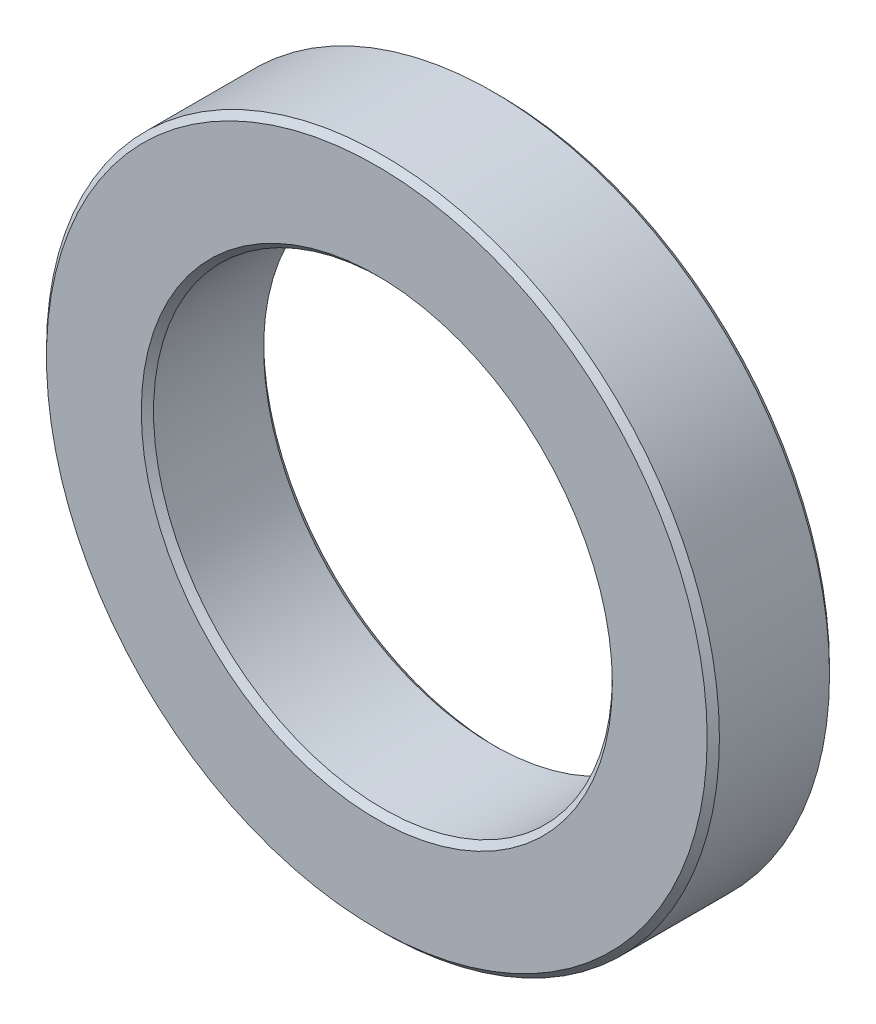
ISO-10303-21;
HEADER;
FILE_DESCRIPTION(('STEP AP214'),'2;1');
FILE_NAME('part.step','',(''),(''),'','','');
FILE_SCHEMA(('AUTOMOTIVE_DESIGN { 1 0 10303 214 1 1 1 1 }'));
ENDSEC;
DATA;
#1=APPLICATION_CONTEXT('core data for automotive mechanical design processes');
#2=APPLICATION_PROTOCOL_DEFINITION('international standard','automotive_design',2000,#1);
#3=PRODUCT_CONTEXT('',#1,'mechanical');
#4=PRODUCT('Part','Part','',(#3));
#5=PRODUCT_RELATED_PRODUCT_CATEGORY('part','',(#4));
#6=PRODUCT_DEFINITION_FORMATION('','',#4);
#7=PRODUCT_DEFINITION_CONTEXT('part definition',#1,'design');
#8=PRODUCT_DEFINITION('design','',#6,#7);
#9=PRODUCT_DEFINITION_SHAPE('','',#8);
#10=(LENGTH_UNIT() NAMED_UNIT(*) SI_UNIT(.MILLI.,.METRE.));
#11=(NAMED_UNIT(*) PLANE_ANGLE_UNIT() SI_UNIT($,.RADIAN.));
#12=(NAMED_UNIT(*) SI_UNIT($,.STERADIAN.) SOLID_ANGLE_UNIT());
#13=UNCERTAINTY_MEASURE_WITH_UNIT(LENGTH_MEASURE(1.E-05),#10,'distance_accuracy_value','');
#14=(GEOMETRIC_REPRESENTATION_CONTEXT(3) GLOBAL_UNCERTAINTY_ASSIGNED_CONTEXT((#13)) GLOBAL_UNIT_ASSIGNED_CONTEXT((#10,
#11,#12)) REPRESENTATION_CONTEXT('',''));
#15=CARTESIAN_POINT('',(0.,0.,0.));
#16=DIRECTION('',(0.,0.,1.));
#17=DIRECTION('',(1.,0.,0.));
#18=AXIS2_PLACEMENT_3D('',#15,#16,#17);
#19=CARTESIAN_POINT('',(-7.28115294937452,5.29006727063225,12.));
#20=DIRECTION('',(0.,0.,-1.));
#21=DIRECTION('',(-1.,0.,0.));
#22=AXIS2_PLACEMENT_3D('',#19,#20,#21);
#23=CYLINDRICAL_SURFACE('',#22,0.999999999999984);
#24=CARTESIAN_POINT('',(-7.28115294937452,5.29006727063225,0.));
#25=DIRECTION('',(0.,0.,1.));
#26=DIRECTION('',(1.,0.,0.));
#27=AXIS2_PLACEMENT_3D('',#24,#25,#26);
#28=CIRCLE('',#27,0.999999999999984);
#29=CARTESIAN_POINT('',(-6.28115294937453,5.29006727063225,0.));
#30=VERTEX_POINT('',#29);
#31=EDGE_CURVE('E98',#30,#30,#28,.T.);
#32=ORIENTED_EDGE('',*,*,#31,.F.);
#33=EDGE_LOOP('',(#32));
#34=FACE_BOUND('',#33,.T.);
#35=CARTESIAN_POINT('',(-7.28115294937452,5.29006727063225,3.));
#36=DIRECTION('',(0.,0.,1.));
#37=DIRECTION('',(1.,0.,0.));
#38=AXIS2_PLACEMENT_3D('',#35,#36,#37);
#39=CIRCLE('',#38,0.999999999999984);
#40=CARTESIAN_POINT('',(-6.28115294937453,5.29006727063225,3.));
#41=VERTEX_POINT('',#40);
#42=EDGE_CURVE('E74',#41,#41,#39,.F.);
#43=ORIENTED_EDGE('',*,*,#42,.F.);
#44=EDGE_LOOP('',(#43));
#45=FACE_BOUND('',#44,.T.);
#46=ADVANCED_FACE('F41',(#34,#45),#23,.F.);
#47=CARTESIAN_POINT('',(2.78115294937452,8.55950864665637,12.));
#48=DIRECTION('',(0.,0.,-1.));
#49=DIRECTION('',(-1.,0.,0.));
#50=AXIS2_PLACEMENT_3D('',#47,#48,#49);
#51=CYLINDRICAL_SURFACE('',#50,0.999999999999898);
#52=CARTESIAN_POINT('',(2.78115294937452,8.55950864665637,0.));
#53=DIRECTION('',(0.,0.,1.));
#54=DIRECTION('',(1.,0.,0.));
#55=AXIS2_PLACEMENT_3D('',#52,#53,#54);
#56=CIRCLE('',#55,0.999999999999898);
#57=CARTESIAN_POINT('',(3.78115294937442,8.55950864665637,0.));
#58=VERTEX_POINT('',#57);
#59=EDGE_CURVE('E101',#58,#58,#56,.T.);
#60=ORIENTED_EDGE('',*,*,#59,.F.);
#61=EDGE_LOOP('',(#60));
#62=FACE_BOUND('',#61,.T.);
#63=CARTESIAN_POINT('',(2.78115294937452,8.55950864665637,3.));
#64=DIRECTION('',(0.,0.,1.));
#65=DIRECTION('',(1.,0.,0.));
#66=AXIS2_PLACEMENT_3D('',#63,#64,#65);
#67=CIRCLE('',#66,0.999999999999898);
#68=CARTESIAN_POINT('',(3.78115294937442,8.55950864665637,3.));
#69=VERTEX_POINT('',#68);
#70=EDGE_CURVE('E77',#69,#69,#67,.F.);
#71=ORIENTED_EDGE('',*,*,#70,.F.);
#72=EDGE_LOOP('',(#71));
#73=FACE_BOUND('',#72,.T.);
#74=ADVANCED_FACE('F107',(#62,#73),#51,.F.);
#75=CARTESIAN_POINT('',(9.00000000000001,0.,12.));
#76=DIRECTION('',(0.,0.,-1.));
#77=DIRECTION('',(-1.,0.,0.));
#78=AXIS2_PLACEMENT_3D('',#75,#76,#77);
#79=CYLINDRICAL_SURFACE('',#78,1.00000000000001);
#80=CARTESIAN_POINT('',(9.00000000000001,0.,0.));
#81=DIRECTION('',(0.,0.,1.));
#82=DIRECTION('',(1.,0.,0.));
#83=AXIS2_PLACEMENT_3D('',#80,#81,#82);
#84=CIRCLE('',#83,1.00000000000001);
#85=CARTESIAN_POINT('',(10.,0.,0.));
#86=VERTEX_POINT('',#85);
#87=EDGE_CURVE('E89',#86,#86,#84,.T.);
#88=ORIENTED_EDGE('',*,*,#87,.F.);
#89=EDGE_LOOP('',(#88));
#90=FACE_BOUND('',#89,.T.);
#91=CARTESIAN_POINT('',(9.00000000000001,0.,3.));
#92=DIRECTION('',(0.,0.,1.));
#93=DIRECTION('',(1.,0.,0.));
#94=AXIS2_PLACEMENT_3D('',#91,#92,#93);
#95=CIRCLE('',#94,1.00000000000001);
#96=CARTESIAN_POINT('',(10.,0.,3.));
#97=VERTEX_POINT('',#96);
#98=EDGE_CURVE('E80',#97,#97,#95,.F.);
#99=ORIENTED_EDGE('',*,*,#98,.F.);
#100=EDGE_LOOP('',(#99));
#101=FACE_BOUND('',#100,.T.);
#102=ADVANCED_FACE('F110',(#90,#101),#79,.F.);
#103=CARTESIAN_POINT('',(2.78115294937453,-8.55950864665637,12.));
#104=DIRECTION('',(0.,0.,-1.));
#105=DIRECTION('',(-1.,0.,0.));
#106=AXIS2_PLACEMENT_3D('',#103,#104,#105);
#107=CYLINDRICAL_SURFACE('',#106,1.00000000000002);
#108=CARTESIAN_POINT('',(2.78115294937453,-8.55950864665637,0.));
#109=DIRECTION('',(0.,0.,1.));
#110=DIRECTION('',(1.,0.,0.));
#111=AXIS2_PLACEMENT_3D('',#108,#109,#110);
#112=CIRCLE('',#111,1.00000000000002);
#113=CARTESIAN_POINT('',(3.78115294937454,-8.55950864665637,0.));
#114=VERTEX_POINT('',#113);
#115=EDGE_CURVE('E92',#114,#114,#112,.T.);
#116=ORIENTED_EDGE('',*,*,#115,.F.);
#117=EDGE_LOOP('',(#116));
#118=FACE_BOUND('',#117,.T.);
#119=CARTESIAN_POINT('',(2.78115294937453,-8.55950864665637,3.));
#120=DIRECTION('',(0.,0.,1.));
#121=DIRECTION('',(1.,0.,0.));
#122=AXIS2_PLACEMENT_3D('',#119,#120,#121);
#123=CIRCLE('',#122,1.00000000000002);
#124=CARTESIAN_POINT('',(3.78115294937454,-8.55950864665637,3.));
#125=VERTEX_POINT('',#124);
#126=EDGE_CURVE('E83',#125,#125,#123,.F.);
#127=ORIENTED_EDGE('',*,*,#126,.F.);
#128=EDGE_LOOP('',(#127));
#129=FACE_BOUND('',#128,.T.);
#130=ADVANCED_FACE('F137',(#118,#129),#107,.F.);
#131=CARTESIAN_POINT('',(-7.28115294937452,-5.29006727063225,12.));
#132=DIRECTION('',(0.,0.,-1.));
#133=DIRECTION('',(-1.,0.,0.));
#134=AXIS2_PLACEMENT_3D('',#131,#132,#133);
#135=CYLINDRICAL_SURFACE('',#134,1.00000000000005);
#136=CARTESIAN_POINT('',(-7.28115294937452,-5.29006727063225,0.));
#137=DIRECTION('',(0.,0.,1.));
#138=DIRECTION('',(1.,0.,0.));
#139=AXIS2_PLACEMENT_3D('',#136,#137,#138);
#140=CIRCLE('',#139,1.00000000000005);
#141=CARTESIAN_POINT('',(-6.28115294937447,-5.29006727063225,0.));
#142=VERTEX_POINT('',#141);
#143=EDGE_CURVE('E95',#142,#142,#140,.T.);
#144=ORIENTED_EDGE('',*,*,#143,.F.);
#145=EDGE_LOOP('',(#144));
#146=FACE_BOUND('',#145,.T.);
#147=CARTESIAN_POINT('',(-7.28115294937452,-5.29006727063225,3.));
#148=DIRECTION('',(0.,0.,1.));
#149=DIRECTION('',(1.,0.,0.));
#150=AXIS2_PLACEMENT_3D('',#147,#148,#149);
#151=CIRCLE('',#150,1.00000000000005);
#152=CARTESIAN_POINT('',(-6.28115294937447,-5.29006727063225,3.));
#153=VERTEX_POINT('',#152);
#154=EDGE_CURVE('E86',#153,#153,#151,.F.);
#155=ORIENTED_EDGE('',*,*,#154,.F.);
#156=EDGE_LOOP('',(#155));
#157=FACE_BOUND('',#156,.T.);
#158=ADVANCED_FACE('F143',(#146,#157),#135,.F.);
#159=CARTESIAN_POINT('',(0.,0.,4.));
#160=DIRECTION('',(0.,0.,1.));
#161=DIRECTION('',(1.,0.,0.));
#162=AXIS2_PLACEMENT_3D('',#159,#160,#161);
#163=PLANE('',#162);
#164=CARTESIAN_POINT('',(0.,0.,4.));
#165=DIRECTION('',(0.,0.,1.));
#166=DIRECTION('',(1.,0.,0.));
#167=AXIS2_PLACEMENT_3D('',#164,#165,#166);
#168=CIRCLE('',#167,10.8);
#169=CARTESIAN_POINT('',(10.8,0.,4.));
#170=VERTEX_POINT('',#169);
#171=EDGE_CURVE('E53',#170,#170,#168,.T.);
#172=ORIENTED_EDGE('',*,*,#171,.T.);
#173=EDGE_LOOP('',(#172));
#174=FACE_BOUND('',#173,.T.);
#175=CARTESIAN_POINT('',(0.,0.,4.));
#176=DIRECTION('',(0.,0.,1.));
#177=DIRECTION('',(1.,0.,0.));
#178=AXIS2_PLACEMENT_3D('',#175,#176,#177);
#179=CIRCLE('',#178,7.69999999999999);
#180=CARTESIAN_POINT('',(7.69999999999999,0.,4.));
#181=VERTEX_POINT('',#180);
#182=EDGE_CURVE('E57',#181,#181,#179,.F.);
#183=ORIENTED_EDGE('',*,*,#182,.T.);
#184=EDGE_LOOP('',(#183));
#185=FACE_BOUND('',#184,.T.);
#186=ADVANCED_FACE('F146',(#174,#185),#163,.T.);
#187=CARTESIAN_POINT('',(0.,0.,0.));
#188=DIRECTION('',(0.,0.,1.));
#189=DIRECTION('',(1.,0.,0.));
#190=AXIS2_PLACEMENT_3D('',#187,#188,#189);
#191=PLANE('',#190);
#192=CARTESIAN_POINT('',(0.,0.,0.));
#193=DIRECTION('',(0.,0.,1.));
#194=DIRECTION('',(1.,0.,0.));
#195=AXIS2_PLACEMENT_3D('',#192,#193,#194);
#196=CIRCLE('',#195,10.8);
#197=CARTESIAN_POINT('',(10.8,0.,0.));
#198=VERTEX_POINT('',#197);
#199=EDGE_CURVE('E62',#198,#198,#196,.F.);
#200=ORIENTED_EDGE('',*,*,#199,.T.);
#201=EDGE_LOOP('',(#200));
#202=FACE_BOUND('',#201,.T.);
#203=CARTESIAN_POINT('',(0.,0.,0.));
#204=DIRECTION('',(0.,0.,1.));
#205=DIRECTION('',(1.,0.,0.));
#206=AXIS2_PLACEMENT_3D('',#203,#204,#205);
#207=CIRCLE('',#206,7.7);
#208=CARTESIAN_POINT('',(7.7,0.,0.));
#209=VERTEX_POINT('',#208);
#210=EDGE_CURVE('E65',#209,#209,#207,.T.);
#211=ORIENTED_EDGE('',*,*,#210,.T.);
#212=EDGE_LOOP('',(#211));
#213=FACE_BOUND('',#212,.T.);
#214=ORIENTED_EDGE('',*,*,#87,.T.);
#215=EDGE_LOOP('',(#214));
#216=FACE_BOUND('',#215,.T.);
#217=ORIENTED_EDGE('',*,*,#115,.T.);
#218=EDGE_LOOP('',(#217));
#219=FACE_BOUND('',#218,.T.);
#220=ORIENTED_EDGE('',*,*,#143,.T.);
#221=EDGE_LOOP('',(#220));
#222=FACE_BOUND('',#221,.T.);
#223=ORIENTED_EDGE('',*,*,#31,.T.);
#224=EDGE_LOOP('',(#223));
#225=FACE_BOUND('',#224,.T.);
#226=ORIENTED_EDGE('',*,*,#59,.T.);
#227=EDGE_LOOP('',(#226));
#228=FACE_BOUND('',#227,.T.);
#229=ADVANCED_FACE('F105',(#202,#213,#216,#219,#222,#225,#228),#191,.F.);
#230=CARTESIAN_POINT('',(0.,0.,4.));
#231=DIRECTION('',(0.,0.,-1.));
#232=DIRECTION('',(-1.,0.,0.));
#233=AXIS2_PLACEMENT_3D('',#230,#231,#232);
#234=CYLINDRICAL_SURFACE('',#233,11.);
#235=CARTESIAN_POINT('',(0.,0.,0.200000000000002));
#236=DIRECTION('',(0.,0.,1.));
#237=DIRECTION('',(1.,0.,0.));
#238=AXIS2_PLACEMENT_3D('',#235,#236,#237);
#239=CIRCLE('',#238,11.);
#240=CARTESIAN_POINT('',(11.,0.,0.200000000000002));
#241=VERTEX_POINT('',#240);
#242=EDGE_CURVE('E68',#241,#241,#239,.T.);
#243=ORIENTED_EDGE('',*,*,#242,.T.);
#244=EDGE_LOOP('',(#243));
#245=FACE_BOUND('',#244,.T.);
#246=CARTESIAN_POINT('',(0.,0.,3.80000000000001));
#247=DIRECTION('',(0.,0.,1.));
#248=DIRECTION('',(1.,0.,0.));
#249=AXIS2_PLACEMENT_3D('',#246,#247,#248);
#250=CIRCLE('',#249,11.);
#251=CARTESIAN_POINT('',(11.,0.,3.80000000000001));
#252=VERTEX_POINT('',#251);
#253=EDGE_CURVE('E71',#252,#252,#250,.F.);
#254=ORIENTED_EDGE('',*,*,#253,.T.);
#255=EDGE_LOOP('',(#254));
#256=FACE_BOUND('',#255,.T.);
#257=ADVANCED_FACE('F153',(#245,#256),#234,.T.);
#258=CARTESIAN_POINT('',(0.,0.,0.));
#259=DIRECTION('',(0.,0.,1.));
#260=DIRECTION('',(1.,0.,0.));
#261=AXIS2_PLACEMENT_3D('',#258,#259,#260);
#262=CYLINDRICAL_SURFACE('',#261,7.5);
#263=CARTESIAN_POINT('',(0.,0.,3.80000000000001));
#264=DIRECTION('',(0.,0.,1.));
#265=DIRECTION('',(1.,0.,0.));
#266=AXIS2_PLACEMENT_3D('',#263,#264,#265);
#267=CIRCLE('',#266,7.5);
#268=CARTESIAN_POINT('',(7.5,0.,3.80000000000001));
#269=VERTEX_POINT('',#268);
#270=EDGE_CURVE('E10',#269,#269,#267,.T.);
#271=ORIENTED_EDGE('',*,*,#270,.T.);
#272=EDGE_LOOP('',(#271));
#273=FACE_BOUND('',#272,.T.);
#274=CARTESIAN_POINT('',(0.,0.,0.199999999999995));
#275=DIRECTION('',(0.,0.,1.));
#276=DIRECTION('',(1.,0.,0.));
#277=AXIS2_PLACEMENT_3D('',#274,#275,#276);
#278=CIRCLE('',#277,7.5);
#279=CARTESIAN_POINT('',(7.5,0.,0.199999999999995));
#280=VERTEX_POINT('',#279);
#281=EDGE_CURVE('E49',#280,#280,#278,.F.);
#282=ORIENTED_EDGE('',*,*,#281,.T.);
#283=EDGE_LOOP('',(#282));
#284=FACE_BOUND('',#283,.T.);
#285=ADVANCED_FACE('F157',(#273,#284),#262,.F.);
#286=CARTESIAN_POINT('',(-7.28115294937452,-5.29006727063225,3.));
#287=DIRECTION('',(0.,0.,1.));
#288=DIRECTION('',(1.,0.,0.));
#289=AXIS2_PLACEMENT_3D('',#286,#287,#288);
#290=PLANE('',#289);
#291=ORIENTED_EDGE('',*,*,#154,.T.);
#292=EDGE_LOOP('',(#291));
#293=FACE_BOUND('',#292,.T.);
#294=ADVANCED_FACE('F199',(#293),#290,.F.);
#295=CARTESIAN_POINT('',(2.78115294937453,-8.55950864665637,3.));
#296=DIRECTION('',(0.,0.,1.));
#297=DIRECTION('',(1.,0.,0.));
#298=AXIS2_PLACEMENT_3D('',#295,#296,#297);
#299=PLANE('',#298);
#300=ORIENTED_EDGE('',*,*,#126,.T.);
#301=EDGE_LOOP('',(#300));
#302=FACE_BOUND('',#301,.T.);
#303=ADVANCED_FACE('F126',(#302),#299,.F.);
#304=CARTESIAN_POINT('',(9.00000000000001,0.,3.));
#305=DIRECTION('',(0.,0.,1.));
#306=DIRECTION('',(1.,0.,0.));
#307=AXIS2_PLACEMENT_3D('',#304,#305,#306);
#308=PLANE('',#307);
#309=ORIENTED_EDGE('',*,*,#98,.T.);
#310=EDGE_LOOP('',(#309));
#311=FACE_BOUND('',#310,.T.);
#312=ADVANCED_FACE('F117',(#311),#308,.F.);
#313=CARTESIAN_POINT('',(2.78115294937452,8.55950864665637,3.));
#314=DIRECTION('',(0.,0.,1.));
#315=DIRECTION('',(1.,0.,0.));
#316=AXIS2_PLACEMENT_3D('',#313,#314,#315);
#317=PLANE('',#316);
#318=ORIENTED_EDGE('',*,*,#70,.T.);
#319=EDGE_LOOP('',(#318));
#320=FACE_BOUND('',#319,.T.);
#321=ADVANCED_FACE('F114',(#320),#317,.F.);
#322=CARTESIAN_POINT('',(-7.28115294937452,5.29006727063225,3.));
#323=DIRECTION('',(0.,0.,1.));
#324=DIRECTION('',(1.,0.,0.));
#325=AXIS2_PLACEMENT_3D('',#322,#323,#324);
#326=PLANE('',#325);
#327=ORIENTED_EDGE('',*,*,#42,.T.);
#328=EDGE_LOOP('',(#327));
#329=FACE_BOUND('',#328,.T.);
#330=ADVANCED_FACE('F116',(#329),#326,.F.);
#331=CARTESIAN_POINT('',(0.,0.,0.200000000000002));
#332=DIRECTION('',(0.,0.,1.));
#333=DIRECTION('',(1.,0.,0.));
#334=AXIS2_PLACEMENT_3D('',#331,#332,#333);
#335=CONICAL_SURFACE('',#334,11.,0.785398163397453);
#336=ORIENTED_EDGE('',*,*,#199,.F.);
#337=EDGE_LOOP('',(#336));
#338=FACE_BOUND('',#337,.T.);
#339=ORIENTED_EDGE('',*,*,#242,.F.);
#340=EDGE_LOOP('',(#339));
#341=FACE_BOUND('',#340,.T.);
#342=ADVANCED_FACE('F123',(#338,#341),#335,.T.);
#343=CARTESIAN_POINT('',(0.,0.,4.));
#344=DIRECTION('',(0.,0.,-1.));
#345=DIRECTION('',(-1.,0.,0.));
#346=AXIS2_PLACEMENT_3D('',#343,#344,#345);
#347=CONICAL_SURFACE('',#346,10.8,0.78539816339744);
#348=ORIENTED_EDGE('',*,*,#253,.F.);
#349=EDGE_LOOP('',(#348));
#350=FACE_BOUND('',#349,.T.);
#351=ORIENTED_EDGE('',*,*,#171,.F.);
#352=EDGE_LOOP('',(#351));
#353=FACE_BOUND('',#352,.T.);
#354=ADVANCED_FACE('F165',(#350,#353),#347,.T.);
#355=CARTESIAN_POINT('',(0.,0.,3.80000000000001));
#356=DIRECTION('',(0.,0.,1.));
#357=DIRECTION('',(1.,0.,0.));
#358=AXIS2_PLACEMENT_3D('',#355,#356,#357);
#359=CONICAL_SURFACE('',#358,7.5,0.785398163397453);
#360=ORIENTED_EDGE('',*,*,#182,.F.);
#361=EDGE_LOOP('',(#360));
#362=FACE_BOUND('',#361,.T.);
#363=ORIENTED_EDGE('',*,*,#270,.F.);
#364=EDGE_LOOP('',(#363));
#365=FACE_BOUND('',#364,.T.);
#366=ADVANCED_FACE('F171',(#362,#365),#359,.F.);
#367=CARTESIAN_POINT('',(0.,0.,0.));
#368=DIRECTION('',(0.,0.,-1.));
#369=DIRECTION('',(-1.,0.,0.));
#370=AXIS2_PLACEMENT_3D('',#367,#368,#369);
#371=CONICAL_SURFACE('',#370,7.7,0.785398163397453);
#372=ORIENTED_EDGE('',*,*,#281,.F.);
#373=EDGE_LOOP('',(#372));
#374=FACE_BOUND('',#373,.T.);
#375=ORIENTED_EDGE('',*,*,#210,.F.);
#376=EDGE_LOOP('',(#375));
#377=FACE_BOUND('',#376,.T.);
#378=ADVANCED_FACE('F44',(#374,#377),#371,.F.);
#379=CLOSED_SHELL('',(#46,#74,#102,#130,#158,#186,#229,#257,#285,#294,#303,#312,#321,#330,#342,
#354,#366,#378));
#380=MANIFOLD_SOLID_BREP('B2',#379);
#381=ADVANCED_BREP_SHAPE_REPRESENTATION('',(#18,#380),#14);
#382=SHAPE_DEFINITION_REPRESENTATION(#9,#381);
ENDSEC;
END-ISO-10303-21;
